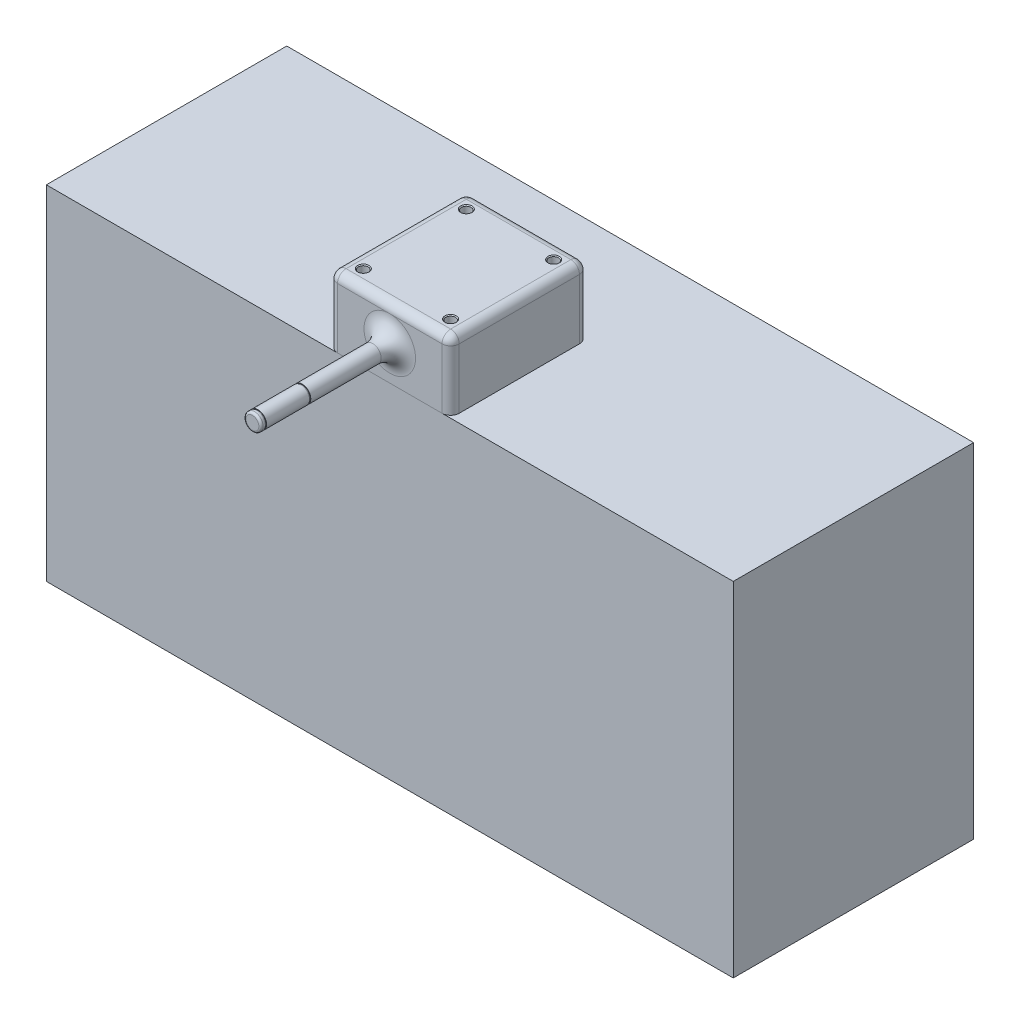
ISO-10303-21;
HEADER;
FILE_DESCRIPTION(('STEP AP214'),'2;1');
FILE_NAME('part.step','',(''),(''),'','','');
FILE_SCHEMA(('AUTOMOTIVE_DESIGN { 1 0 10303 214 1 1 1 1 }'));
ENDSEC;
DATA;
#1=APPLICATION_CONTEXT('core data for automotive mechanical design processes');
#2=APPLICATION_PROTOCOL_DEFINITION('international standard','automotive_design',2000,#1);
#3=PRODUCT_CONTEXT('',#1,'mechanical');
#4=PRODUCT('Part','Part','',(#3));
#5=PRODUCT_RELATED_PRODUCT_CATEGORY('part','',(#4));
#6=PRODUCT_DEFINITION_FORMATION('','',#4);
#7=PRODUCT_DEFINITION_CONTEXT('part definition',#1,'design');
#8=PRODUCT_DEFINITION('design','',#6,#7);
#9=PRODUCT_DEFINITION_SHAPE('','',#8);
#10=(LENGTH_UNIT() NAMED_UNIT(*) SI_UNIT(.MILLI.,.METRE.));
#11=(NAMED_UNIT(*) PLANE_ANGLE_UNIT() SI_UNIT($,.RADIAN.));
#12=(NAMED_UNIT(*) SI_UNIT($,.STERADIAN.) SOLID_ANGLE_UNIT());
#13=UNCERTAINTY_MEASURE_WITH_UNIT(LENGTH_MEASURE(1.E-05),#10,'distance_accuracy_value','');
#14=(GEOMETRIC_REPRESENTATION_CONTEXT(3) GLOBAL_UNCERTAINTY_ASSIGNED_CONTEXT((#13)) GLOBAL_UNIT_ASSIGNED_CONTEXT((#10,
#11,#12)) REPRESENTATION_CONTEXT('',''));
#15=CARTESIAN_POINT('',(0.,0.,0.));
#16=DIRECTION('',(0.,0.,1.));
#17=DIRECTION('',(1.,0.,0.));
#18=AXIS2_PLACEMENT_3D('',#15,#16,#17);
#19=CARTESIAN_POINT('',(254.,-279.4,0.));
#20=DIRECTION('',(-1.,0.,0.));
#21=DIRECTION('',(0.,0.,1.));
#22=AXIS2_PLACEMENT_3D('',#19,#20,#21);
#23=PLANE('',#22);
#24=DIRECTION('',(0.,0.,1.));
#25=VECTOR('',#24,1.);
#26=CARTESIAN_POINT('',(254.,-25.4,0.));
#27=LINE('',#26,#25);
#28=CARTESIAN_POINT('',(254.,-25.4,-177.8));
#29=VERTEX_POINT('',#28);
#30=CARTESIAN_POINT('',(254.,-25.4,0.));
#31=VERTEX_POINT('',#30);
#32=EDGE_CURVE('E112',#29,#31,#27,.T.);
#33=ORIENTED_EDGE('',*,*,#32,.T.);
#34=DIRECTION('',(0.,1.,0.));
#35=VECTOR('',#34,1.);
#36=CARTESIAN_POINT('',(254.,-279.4,0.));
#37=LINE('',#36,#35);
#38=CARTESIAN_POINT('',(254.,-279.4,0.));
#39=VERTEX_POINT('',#38);
#40=EDGE_CURVE('E12',#39,#31,#37,.T.);
#41=ORIENTED_EDGE('',*,*,#40,.F.);
#42=DIRECTION('',(0.,0.,1.));
#43=VECTOR('',#42,1.);
#44=CARTESIAN_POINT('',(254.,-279.4,0.));
#45=LINE('',#44,#43);
#46=CARTESIAN_POINT('',(254.,-279.4,-177.8));
#47=VERTEX_POINT('',#46);
#48=EDGE_CURVE('E105',#47,#39,#45,.T.);
#49=ORIENTED_EDGE('',*,*,#48,.F.);
#50=DIRECTION('',(0.,1.,0.));
#51=VECTOR('',#50,1.);
#52=CARTESIAN_POINT('',(254.,-279.4,-177.8));
#53=LINE('',#52,#51);
#54=EDGE_CURVE('E109',#47,#29,#53,.T.);
#55=ORIENTED_EDGE('',*,*,#54,.T.);
#56=EDGE_LOOP('',(#33,#41,#49,#55));
#57=FACE_BOUND('',#56,.T.);
#58=ADVANCED_FACE('F51',(#57),#23,.F.);
#59=CARTESIAN_POINT('',(-254.,-279.4,0.));
#60=DIRECTION('',(0.,0.,-1.));
#61=DIRECTION('',(-1.,0.,0.));
#62=AXIS2_PLACEMENT_3D('',#59,#60,#61);
#63=PLANE('',#62);
#64=DIRECTION('',(-1.,0.,0.));
#65=VECTOR('',#64,1.);
#66=CARTESIAN_POINT('',(-254.,-25.4,0.));
#67=LINE('',#66,#65);
#68=CARTESIAN_POINT('',(-254.,-25.4,0.));
#69=VERTEX_POINT('',#68);
#70=EDGE_CURVE('E106',#31,#69,#67,.T.);
#71=ORIENTED_EDGE('',*,*,#70,.T.);
#72=DIRECTION('',(0.,1.,0.));
#73=VECTOR('',#72,1.);
#74=CARTESIAN_POINT('',(-254.,-279.4,0.));
#75=LINE('',#74,#73);
#76=CARTESIAN_POINT('',(-254.,-279.4,0.));
#77=VERTEX_POINT('',#76);
#78=EDGE_CURVE('E56',#77,#69,#75,.T.);
#79=ORIENTED_EDGE('',*,*,#78,.F.);
#80=DIRECTION('',(-1.,0.,0.));
#81=VECTOR('',#80,1.);
#82=CARTESIAN_POINT('',(-254.,-279.4,0.));
#83=LINE('',#82,#81);
#84=EDGE_CURVE('E97',#39,#77,#83,.T.);
#85=ORIENTED_EDGE('',*,*,#84,.F.);
#86=ORIENTED_EDGE('',*,*,#40,.T.);
#87=EDGE_LOOP('',(#71,#79,#85,#86));
#88=FACE_BOUND('',#87,.T.);
#89=ADVANCED_FACE('F102',(#88),#63,.F.);
#90=CARTESIAN_POINT('',(-254.,-279.4,0.));
#91=DIRECTION('',(1.,0.,0.));
#92=DIRECTION('',(0.,0.,-1.));
#93=AXIS2_PLACEMENT_3D('',#90,#91,#92);
#94=PLANE('',#93);
#95=DIRECTION('',(0.,0.,-1.));
#96=VECTOR('',#95,1.);
#97=CARTESIAN_POINT('',(-254.,-25.4,0.));
#98=LINE('',#97,#96);
#99=CARTESIAN_POINT('',(-254.,-25.4,-177.8));
#100=VERTEX_POINT('',#99);
#101=EDGE_CURVE('E85',#69,#100,#98,.T.);
#102=ORIENTED_EDGE('',*,*,#101,.T.);
#103=DIRECTION('',(0.,1.,0.));
#104=VECTOR('',#103,1.);
#105=CARTESIAN_POINT('',(-254.,-279.4,-177.8));
#106=LINE('',#105,#104);
#107=CARTESIAN_POINT('',(-254.,-279.4,-177.8));
#108=VERTEX_POINT('',#107);
#109=EDGE_CURVE('E110',#108,#100,#106,.T.);
#110=ORIENTED_EDGE('',*,*,#109,.F.);
#111=DIRECTION('',(0.,0.,-1.));
#112=VECTOR('',#111,1.);
#113=CARTESIAN_POINT('',(-254.,-279.4,0.));
#114=LINE('',#113,#112);
#115=EDGE_CURVE('E99',#77,#108,#114,.T.);
#116=ORIENTED_EDGE('',*,*,#115,.F.);
#117=ORIENTED_EDGE('',*,*,#78,.T.);
#118=EDGE_LOOP('',(#102,#110,#116,#117));
#119=FACE_BOUND('',#118,.T.);
#120=ADVANCED_FACE('F108',(#119),#94,.F.);
#121=CARTESIAN_POINT('',(-254.,-279.4,-177.8));
#122=DIRECTION('',(0.,0.,1.));
#123=DIRECTION('',(1.,0.,0.));
#124=AXIS2_PLACEMENT_3D('',#121,#122,#123);
#125=PLANE('',#124);
#126=DIRECTION('',(1.,0.,0.));
#127=VECTOR('',#126,1.);
#128=CARTESIAN_POINT('',(-254.,-25.4,-177.8));
#129=LINE('',#128,#127);
#130=EDGE_CURVE('E87',#100,#29,#129,.T.);
#131=ORIENTED_EDGE('',*,*,#130,.T.);
#132=ORIENTED_EDGE('',*,*,#54,.F.);
#133=DIRECTION('',(1.,0.,0.));
#134=VECTOR('',#133,1.);
#135=CARTESIAN_POINT('',(-254.,-279.4,-177.8));
#136=LINE('',#135,#134);
#137=EDGE_CURVE('E66',#108,#47,#136,.T.);
#138=ORIENTED_EDGE('',*,*,#137,.F.);
#139=ORIENTED_EDGE('',*,*,#109,.T.);
#140=EDGE_LOOP('',(#131,#132,#138,#139));
#141=FACE_BOUND('',#140,.T.);
#142=ADVANCED_FACE('F122',(#141),#125,.F.);
#143=CARTESIAN_POINT('',(0.,-279.4,0.));
#144=DIRECTION('',(0.,-1.,0.));
#145=DIRECTION('',(0.,0.,-1.));
#146=AXIS2_PLACEMENT_3D('',#143,#144,#145);
#147=PLANE('',#146);
#148=ORIENTED_EDGE('',*,*,#48,.T.);
#149=ORIENTED_EDGE('',*,*,#84,.T.);
#150=ORIENTED_EDGE('',*,*,#115,.T.);
#151=ORIENTED_EDGE('',*,*,#137,.T.);
#152=EDGE_LOOP('',(#148,#149,#150,#151));
#153=FACE_BOUND('',#152,.T.);
#154=ADVANCED_FACE('F96',(#153),#147,.T.);
#155=CARTESIAN_POINT('',(0.,-25.4,0.));
#156=DIRECTION('',(0.,-1.,0.));
#157=DIRECTION('',(0.,0.,-1.));
#158=AXIS2_PLACEMENT_3D('',#155,#156,#157);
#159=PLANE('',#158);
#160=ORIENTED_EDGE('',*,*,#32,.F.);
#161=ORIENTED_EDGE('',*,*,#130,.F.);
#162=ORIENTED_EDGE('',*,*,#101,.F.);
#163=ORIENTED_EDGE('',*,*,#70,.F.);
#164=EDGE_LOOP('',(#160,#161,#162,#163));
#165=FACE_BOUND('',#164,.T.);
#166=ADVANCED_FACE('F121',(#165),#159,.F.);
#167=CLOSED_SHELL('',(#58,#89,#120,#142,#154,#166));
#168=MANIFOLD_SOLID_BREP('B2',#167);
#169=CARTESIAN_POINT('',(0.,0.,101.6));
#170=DIRECTION('',(0.,0.,-1.));
#171=DIRECTION('',(-1.,0.,0.));
#172=AXIS2_PLACEMENT_3D('',#169,#170,#171);
#173=CYLINDRICAL_SURFACE('',#172,6.35);
#174=CARTESIAN_POINT('',(0.,0.,12.7));
#175=DIRECTION('',(0.,0.,-1.));
#176=DIRECTION('',(-1.,0.,0.));
#177=AXIS2_PLACEMENT_3D('',#174,#175,#176);
#178=CIRCLE('',#177,6.35);
#179=CARTESIAN_POINT('',(-6.35,0.,12.7));
#180=VERTEX_POINT('',#179);
#181=EDGE_CURVE('E320',#180,#180,#178,.F.);
#182=ORIENTED_EDGE('',*,*,#181,.T.);
#183=EDGE_LOOP('',(#182));
#184=FACE_BOUND('',#183,.T.);
#185=CARTESIAN_POINT('',(0.,0.,64.77));
#186=DIRECTION('',(0.,0.,1.));
#187=DIRECTION('',(1.,0.,0.));
#188=AXIS2_PLACEMENT_3D('',#185,#186,#187);
#189=CIRCLE('',#188,6.35);
#190=CARTESIAN_POINT('',(6.35,0.,64.77));
#191=VERTEX_POINT('',#190);
#192=EDGE_CURVE('E412',#191,#191,#189,.T.);
#193=ORIENTED_EDGE('',*,*,#192,.F.);
#194=EDGE_LOOP('',(#193));
#195=FACE_BOUND('',#194,.T.);
#196=ADVANCED_FACE('F174',(#184,#195),#173,.T.);
#197=CARTESIAN_POINT('',(-45.,25.4,-101.6));
#198=DIRECTION('',(0.,-1.,0.));
#199=DIRECTION('',(0.,0.,-1.));
#200=AXIS2_PLACEMENT_3D('',#197,#198,#199);
#201=PLANE('',#200);
#202=CARTESIAN_POINT('',(-32.3,25.4,-88.9));
#203=DIRECTION('',(0.,1.,0.));
#204=DIRECTION('',(0.,0.,1.));
#205=AXIS2_PLACEMENT_3D('',#202,#203,#204);
#206=CIRCLE('',#205,4.2037);
#207=CARTESIAN_POINT('',(-32.3,25.4,-84.6963));
#208=VERTEX_POINT('',#207);
#209=EDGE_CURVE('E402',#208,#208,#206,.T.);
#210=ORIENTED_EDGE('',*,*,#209,.F.);
#211=EDGE_LOOP('',(#210));
#212=FACE_BOUND('',#211,.T.);
#213=CARTESIAN_POINT('',(-32.3,25.4,-12.7));
#214=DIRECTION('',(0.,1.,0.));
#215=DIRECTION('',(0.,0.,1.));
#216=AXIS2_PLACEMENT_3D('',#213,#214,#215);
#217=CIRCLE('',#216,4.2037);
#218=CARTESIAN_POINT('',(-32.3,25.4,-8.4963));
#219=VERTEX_POINT('',#218);
#220=EDGE_CURVE('E421',#219,#219,#217,.T.);
#221=ORIENTED_EDGE('',*,*,#220,.F.);
#222=EDGE_LOOP('',(#221));
#223=FACE_BOUND('',#222,.T.);
#224=CARTESIAN_POINT('',(32.3,25.4,-12.7));
#225=DIRECTION('',(0.,1.,0.));
#226=DIRECTION('',(0.,0.,1.));
#227=AXIS2_PLACEMENT_3D('',#224,#225,#226);
#228=CIRCLE('',#227,4.2037);
#229=CARTESIAN_POINT('',(32.3,25.4,-8.49629999999999));
#230=VERTEX_POINT('',#229);
#231=EDGE_CURVE('E435',#230,#230,#228,.T.);
#232=ORIENTED_EDGE('',*,*,#231,.F.);
#233=EDGE_LOOP('',(#232));
#234=FACE_BOUND('',#233,.T.);
#235=CARTESIAN_POINT('',(32.3,25.4,-88.9));
#236=DIRECTION('',(0.,1.,0.));
#237=DIRECTION('',(0.,0.,1.));
#238=AXIS2_PLACEMENT_3D('',#235,#236,#237);
#239=CIRCLE('',#238,4.2037);
#240=CARTESIAN_POINT('',(32.3,25.4,-84.6963));
#241=VERTEX_POINT('',#240);
#242=EDGE_CURVE('E441',#241,#241,#239,.T.);
#243=ORIENTED_EDGE('',*,*,#242,.F.);
#244=EDGE_LOOP('',(#243));
#245=FACE_BOUND('',#244,.T.);
#246=DIRECTION('',(0.,0.,1.));
#247=VECTOR('',#246,1.);
#248=CARTESIAN_POINT('',(38.65,25.4,-101.6));
#249=LINE('',#248,#247);
#250=CARTESIAN_POINT('',(38.65,25.4,-6.34999999999999));
#251=VERTEX_POINT('',#250);
#252=CARTESIAN_POINT('',(38.65,25.4,-95.25));
#253=VERTEX_POINT('',#252);
#254=EDGE_CURVE('E191',#251,#253,#249,.F.);
#255=ORIENTED_EDGE('',*,*,#254,.T.);
#256=DIRECTION('',(1.,0.,0.));
#257=VECTOR('',#256,1.);
#258=CARTESIAN_POINT('',(-45.,25.4,-95.25));
#259=LINE('',#258,#257);
#260=CARTESIAN_POINT('',(-38.65,25.4,-95.25));
#261=VERTEX_POINT('',#260);
#262=EDGE_CURVE('E314',#253,#261,#259,.F.);
#263=ORIENTED_EDGE('',*,*,#262,.T.);
#264=DIRECTION('',(0.,0.,1.));
#265=VECTOR('',#264,1.);
#266=CARTESIAN_POINT('',(-38.65,25.4,0.));
#267=LINE('',#266,#265);
#268=CARTESIAN_POINT('',(-38.65,25.4,-6.34999999999999));
#269=VERTEX_POINT('',#268);
#270=EDGE_CURVE('E309',#261,#269,#267,.T.);
#271=ORIENTED_EDGE('',*,*,#270,.T.);
#272=DIRECTION('',(1.,0.,0.));
#273=VECTOR('',#272,1.);
#274=CARTESIAN_POINT('',(-45.,25.4,-6.34999999999999));
#275=LINE('',#274,#273);
#276=EDGE_CURVE('E315',#269,#251,#275,.T.);
#277=ORIENTED_EDGE('',*,*,#276,.T.);
#278=EDGE_LOOP('',(#255,#263,#271,#277));
#279=FACE_BOUND('',#278,.T.);
#280=ADVANCED_FACE('F372',(#212,#223,#234,#245,#279),#201,.F.);
#281=CARTESIAN_POINT('',(45.,25.4,-101.6));
#282=DIRECTION('',(-1.,0.,0.));
#283=DIRECTION('',(0.,0.,1.));
#284=AXIS2_PLACEMENT_3D('',#281,#282,#283);
#285=PLANE('',#284);
#286=DIRECTION('',(0.,0.,1.));
#287=VECTOR('',#286,1.);
#288=CARTESIAN_POINT('',(45.,19.05,-101.6));
#289=LINE('',#288,#287);
#290=CARTESIAN_POINT('',(45.,19.05,-95.25));
#291=VERTEX_POINT('',#290);
#292=CARTESIAN_POINT('',(45.,19.05,-6.34999999999999));
#293=VERTEX_POINT('',#292);
#294=EDGE_CURVE('E273',#291,#293,#289,.T.);
#295=ORIENTED_EDGE('',*,*,#294,.T.);
#296=DIRECTION('',(0.,-1.,0.));
#297=VECTOR('',#296,1.);
#298=CARTESIAN_POINT('',(45.,25.4,-6.34999999999999));
#299=LINE('',#298,#297);
#300=CARTESIAN_POINT('',(45.,-25.4,-6.34999999999999));
#301=VERTEX_POINT('',#300);
#302=EDGE_CURVE('E274',#293,#301,#299,.T.);
#303=ORIENTED_EDGE('',*,*,#302,.T.);
#304=DIRECTION('',(0.,0.,1.));
#305=VECTOR('',#304,1.);
#306=CARTESIAN_POINT('',(45.,-25.4,-101.6));
#307=LINE('',#306,#305);
#308=CARTESIAN_POINT('',(45.,-25.4,-95.25));
#309=VERTEX_POINT('',#308);
#310=EDGE_CURVE('E260',#309,#301,#307,.T.);
#311=ORIENTED_EDGE('',*,*,#310,.F.);
#312=DIRECTION('',(0.,-1.,0.));
#313=VECTOR('',#312,1.);
#314=CARTESIAN_POINT('',(45.,25.4,-95.25));
#315=LINE('',#314,#313);
#316=EDGE_CURVE('E272',#309,#291,#315,.F.);
#317=ORIENTED_EDGE('',*,*,#316,.T.);
#318=EDGE_LOOP('',(#295,#303,#311,#317));
#319=FACE_BOUND('',#318,.T.);
#320=ADVANCED_FACE('F269',(#319),#285,.F.);
#321=CARTESIAN_POINT('',(-45.,-25.4,-101.6));
#322=DIRECTION('',(0.,-1.,0.));
#323=DIRECTION('',(0.,0.,-1.));
#324=AXIS2_PLACEMENT_3D('',#321,#322,#323);
#325=PLANE('',#324);
#326=CARTESIAN_POINT('',(-32.3,-25.4,-88.9));
#327=DIRECTION('',(0.,1.,0.));
#328=DIRECTION('',(0.,0.,1.));
#329=AXIS2_PLACEMENT_3D('',#326,#327,#328);
#330=CIRCLE('',#329,3.56869999999996);
#331=CARTESIAN_POINT('',(-32.3,-25.4,-85.3313));
#332=VERTEX_POINT('',#331);
#333=EDGE_CURVE('E419',#332,#332,#330,.T.);
#334=ORIENTED_EDGE('',*,*,#333,.T.);
#335=EDGE_LOOP('',(#334));
#336=FACE_BOUND('',#335,.T.);
#337=CARTESIAN_POINT('',(-32.3,-25.4,-12.7));
#338=DIRECTION('',(0.,1.,0.));
#339=DIRECTION('',(0.,0.,1.));
#340=AXIS2_PLACEMENT_3D('',#337,#338,#339);
#341=CIRCLE('',#340,3.56869999999996);
#342=CARTESIAN_POINT('',(-32.3,-25.4,-9.13130000000004));
#343=VERTEX_POINT('',#342);
#344=EDGE_CURVE('E429',#343,#343,#341,.T.);
#345=ORIENTED_EDGE('',*,*,#344,.T.);
#346=EDGE_LOOP('',(#345));
#347=FACE_BOUND('',#346,.T.);
#348=CARTESIAN_POINT('',(32.3,-25.4,-12.7));
#349=DIRECTION('',(0.,1.,0.));
#350=DIRECTION('',(0.,0.,1.));
#351=AXIS2_PLACEMENT_3D('',#348,#349,#350);
#352=CIRCLE('',#351,3.56869999999997);
#353=CARTESIAN_POINT('',(32.3,-25.4,-9.13130000000003));
#354=VERTEX_POINT('',#353);
#355=EDGE_CURVE('E438',#354,#354,#352,.T.);
#356=ORIENTED_EDGE('',*,*,#355,.T.);
#357=EDGE_LOOP('',(#356));
#358=FACE_BOUND('',#357,.T.);
#359=CARTESIAN_POINT('',(32.3,-25.4,-88.9));
#360=DIRECTION('',(0.,1.,0.));
#361=DIRECTION('',(0.,0.,1.));
#362=AXIS2_PLACEMENT_3D('',#359,#360,#361);
#363=CIRCLE('',#362,3.56869999999996);
#364=CARTESIAN_POINT('',(32.3,-25.4,-85.3313000000001));
#365=VERTEX_POINT('',#364);
#366=EDGE_CURVE('E324',#365,#365,#363,.T.);
#367=ORIENTED_EDGE('',*,*,#366,.T.);
#368=EDGE_LOOP('',(#367));
#369=FACE_BOUND('',#368,.T.);
#370=ORIENTED_EDGE('',*,*,#310,.T.);
#371=CARTESIAN_POINT('',(38.65,-25.4,-6.34999999999999));
#372=DIRECTION('',(0.,-1.,0.));
#373=DIRECTION('',(0.,0.,-1.));
#374=AXIS2_PLACEMENT_3D('',#371,#372,#373);
#375=CIRCLE('',#374,6.35);
#376=CARTESIAN_POINT('',(38.65,-25.4,0.));
#377=VERTEX_POINT('',#376);
#378=EDGE_CURVE('E262',#301,#377,#375,.T.);
#379=ORIENTED_EDGE('',*,*,#378,.T.);
#380=DIRECTION('',(1.,0.,0.));
#381=VECTOR('',#380,1.);
#382=CARTESIAN_POINT('',(-45.,-25.4,0.));
#383=LINE('',#382,#381);
#384=CARTESIAN_POINT('',(-38.65,-25.4,0.));
#385=VERTEX_POINT('',#384);
#386=EDGE_CURVE('E352',#385,#377,#383,.T.);
#387=ORIENTED_EDGE('',*,*,#386,.F.);
#388=CARTESIAN_POINT('',(-38.65,-25.4,-6.35));
#389=DIRECTION('',(0.,-1.,0.));
#390=DIRECTION('',(0.,0.,-1.));
#391=AXIS2_PLACEMENT_3D('',#388,#389,#390);
#392=CIRCLE('',#391,6.35);
#393=CARTESIAN_POINT('',(-45.,-25.4,-6.34999999999999));
#394=VERTEX_POINT('',#393);
#395=EDGE_CURVE('E285',#385,#394,#392,.T.);
#396=ORIENTED_EDGE('',*,*,#395,.T.);
#397=DIRECTION('',(0.,0.,1.));
#398=VECTOR('',#397,1.);
#399=CARTESIAN_POINT('',(-45.,-25.4,-101.6));
#400=LINE('',#399,#398);
#401=CARTESIAN_POINT('',(-45.,-25.4,-95.25));
#402=VERTEX_POINT('',#401);
#403=EDGE_CURVE('E278',#402,#394,#400,.T.);
#404=ORIENTED_EDGE('',*,*,#403,.F.);
#405=CARTESIAN_POINT('',(-38.65,-25.4,-95.25));
#406=DIRECTION('',(0.,-1.,0.));
#407=DIRECTION('',(0.,0.,-1.));
#408=AXIS2_PLACEMENT_3D('',#405,#406,#407);
#409=CIRCLE('',#408,6.35);
#410=CARTESIAN_POINT('',(-38.65,-25.4,-101.6));
#411=VERTEX_POINT('',#410);
#412=EDGE_CURVE('E266',#402,#411,#409,.T.);
#413=ORIENTED_EDGE('',*,*,#412,.T.);
#414=DIRECTION('',(1.,0.,0.));
#415=VECTOR('',#414,1.);
#416=CARTESIAN_POINT('',(-45.,-25.4,-101.6));
#417=LINE('',#416,#415);
#418=CARTESIAN_POINT('',(38.65,-25.4,-101.6));
#419=VERTEX_POINT('',#418);
#420=EDGE_CURVE('E264',#411,#419,#417,.T.);
#421=ORIENTED_EDGE('',*,*,#420,.T.);
#422=CARTESIAN_POINT('',(38.65,-25.4,-95.25));
#423=DIRECTION('',(0.,-1.,0.));
#424=DIRECTION('',(0.,0.,-1.));
#425=AXIS2_PLACEMENT_3D('',#422,#423,#424);
#426=CIRCLE('',#425,6.35);
#427=EDGE_CURVE('E258',#419,#309,#426,.T.);
#428=ORIENTED_EDGE('',*,*,#427,.T.);
#429=EDGE_LOOP('',(#370,#379,#387,#396,#404,#413,#421,#428));
#430=FACE_BOUND('',#429,.T.);
#431=ADVANCED_FACE('F257',(#336,#347,#358,#369,#430),#325,.T.);
#432=CARTESIAN_POINT('',(-45.,25.4,-101.6));
#433=DIRECTION('',(-1.,0.,0.));
#434=DIRECTION('',(0.,0.,1.));
#435=AXIS2_PLACEMENT_3D('',#432,#433,#434);
#436=PLANE('',#435);
#437=DIRECTION('',(0.,0.,1.));
#438=VECTOR('',#437,1.);
#439=CARTESIAN_POINT('',(-45.,19.05,-101.6));
#440=LINE('',#439,#438);
#441=CARTESIAN_POINT('',(-45.,19.05,-6.35));
#442=VERTEX_POINT('',#441);
#443=CARTESIAN_POINT('',(-45.,19.05,-95.25));
#444=VERTEX_POINT('',#443);
#445=EDGE_CURVE('E302',#442,#444,#440,.F.);
#446=ORIENTED_EDGE('',*,*,#445,.T.);
#447=DIRECTION('',(0.,-1.,0.));
#448=VECTOR('',#447,1.);
#449=CARTESIAN_POINT('',(-45.,25.4,-95.25));
#450=LINE('',#449,#448);
#451=EDGE_CURVE('E308',#444,#402,#450,.T.);
#452=ORIENTED_EDGE('',*,*,#451,.T.);
#453=ORIENTED_EDGE('',*,*,#403,.T.);
#454=DIRECTION('',(0.,-1.,0.));
#455=VECTOR('',#454,1.);
#456=CARTESIAN_POINT('',(-45.,25.4,-6.35));
#457=LINE('',#456,#455);
#458=EDGE_CURVE('E306',#394,#442,#457,.F.);
#459=ORIENTED_EDGE('',*,*,#458,.T.);
#460=EDGE_LOOP('',(#446,#452,#453,#459));
#461=FACE_BOUND('',#460,.T.);
#462=ADVANCED_FACE('F459',(#461),#436,.T.);
#463=CARTESIAN_POINT('',(0.,0.,-101.6));
#464=DIRECTION('',(0.,0.,-1.));
#465=DIRECTION('',(-1.,0.,0.));
#466=AXIS2_PLACEMENT_3D('',#463,#464,#465);
#467=PLANE('',#466);
#468=DIRECTION('',(1.,0.,0.));
#469=VECTOR('',#468,1.);
#470=CARTESIAN_POINT('',(45.,19.05,-101.6));
#471=LINE('',#470,#469);
#472=CARTESIAN_POINT('',(-38.65,19.05,-101.6));
#473=VERTEX_POINT('',#472);
#474=CARTESIAN_POINT('',(38.65,19.05,-101.6));
#475=VERTEX_POINT('',#474);
#476=EDGE_CURVE('E296',#473,#475,#471,.T.);
#477=ORIENTED_EDGE('',*,*,#476,.T.);
#478=DIRECTION('',(0.,-1.,0.));
#479=VECTOR('',#478,1.);
#480=CARTESIAN_POINT('',(38.65,-25.4,-101.6));
#481=LINE('',#480,#479);
#482=EDGE_CURVE('E305',#475,#419,#481,.T.);
#483=ORIENTED_EDGE('',*,*,#482,.T.);
#484=ORIENTED_EDGE('',*,*,#420,.F.);
#485=DIRECTION('',(0.,-1.,0.));
#486=VECTOR('',#485,1.);
#487=CARTESIAN_POINT('',(-38.65,0.,-101.6));
#488=LINE('',#487,#486);
#489=EDGE_CURVE('E297',#411,#473,#488,.F.);
#490=ORIENTED_EDGE('',*,*,#489,.T.);
#491=EDGE_LOOP('',(#477,#483,#484,#490));
#492=FACE_BOUND('',#491,.T.);
#493=ADVANCED_FACE('F484',(#492),#467,.T.);
#494=CARTESIAN_POINT('',(0.,0.,0.));
#495=DIRECTION('',(0.,0.,-1.));
#496=DIRECTION('',(-1.,0.,0.));
#497=AXIS2_PLACEMENT_3D('',#494,#495,#496);
#498=PLANE('',#497);
#499=DIRECTION('',(1.,0.,0.));
#500=VECTOR('',#499,1.);
#501=CARTESIAN_POINT('',(0.,19.05,0.));
#502=LINE('',#501,#500);
#503=CARTESIAN_POINT('',(38.65,19.05,0.));
#504=VERTEX_POINT('',#503);
#505=CARTESIAN_POINT('',(0.,19.05,0.));
#506=VERTEX_POINT('',#505);
#507=EDGE_CURVE('E293',#504,#506,#502,.F.);
#508=ORIENTED_EDGE('',*,*,#507,.T.);
#509=CARTESIAN_POINT('',(0.,0.,0.));
#510=DIRECTION('',(0.,0.,-1.));
#511=DIRECTION('',(-1.,0.,0.));
#512=AXIS2_PLACEMENT_3D('',#509,#510,#511);
#513=CIRCLE('',#512,19.05);
#514=EDGE_CURVE('E189',#506,#506,#513,.T.);
#515=ORIENTED_EDGE('',*,*,#514,.T.);
#516=CARTESIAN_POINT('',(-38.65,19.05,0.));
#517=VERTEX_POINT('',#516);
#518=EDGE_CURVE('E289',#506,#517,#502,.F.);
#519=ORIENTED_EDGE('',*,*,#518,.T.);
#520=DIRECTION('',(0.,-1.,0.));
#521=VECTOR('',#520,1.);
#522=CARTESIAN_POINT('',(-38.65,-25.4,0.));
#523=LINE('',#522,#521);
#524=EDGE_CURVE('E295',#517,#385,#523,.T.);
#525=ORIENTED_EDGE('',*,*,#524,.T.);
#526=ORIENTED_EDGE('',*,*,#386,.T.);
#527=DIRECTION('',(0.,-1.,0.));
#528=VECTOR('',#527,1.);
#529=CARTESIAN_POINT('',(38.65,0.,0.));
#530=LINE('',#529,#528);
#531=EDGE_CURVE('E298',#377,#504,#530,.F.);
#532=ORIENTED_EDGE('',*,*,#531,.T.);
#533=EDGE_LOOP('',(#508,#515,#519,#525,#526,#532));
#534=FACE_BOUND('',#533,.T.);
#535=ADVANCED_FACE('F487',(#534),#498,.F.);
#536=CARTESIAN_POINT('',(-38.65,25.4,-95.25));
#537=DIRECTION('',(0.,-1.,0.));
#538=DIRECTION('',(0.,0.,-1.));
#539=AXIS2_PLACEMENT_3D('',#536,#537,#538);
#540=CYLINDRICAL_SURFACE('',#539,6.35);
#541=CARTESIAN_POINT('',(-38.65,19.05,-95.25));
#542=DIRECTION('',(0.,1.,0.));
#543=DIRECTION('',(0.,0.,1.));
#544=AXIS2_PLACEMENT_3D('',#541,#542,#543);
#545=CIRCLE('',#544,6.35);
#546=EDGE_CURVE('E347',#473,#444,#545,.T.);
#547=ORIENTED_EDGE('',*,*,#546,.F.);
#548=ORIENTED_EDGE('',*,*,#489,.F.);
#549=ORIENTED_EDGE('',*,*,#412,.F.);
#550=ORIENTED_EDGE('',*,*,#451,.F.);
#551=EDGE_LOOP('',(#547,#548,#549,#550));
#552=FACE_BOUND('',#551,.T.);
#553=ADVANCED_FACE('F471',(#552),#540,.T.);
#554=CARTESIAN_POINT('',(-38.65,19.05,-95.25));
#555=DIRECTION('',(-1.,0.,0.));
#556=DIRECTION('',(0.,0.,1.));
#557=AXIS2_PLACEMENT_3D('',#554,#555,#556);
#558=SPHERICAL_SURFACE('',#557,6.35);
#559=CARTESIAN_POINT('',(-38.65,19.05,-95.25));
#560=DIRECTION('',(-1.,0.,0.));
#561=DIRECTION('',(0.,0.,1.));
#562=AXIS2_PLACEMENT_3D('',#559,#560,#561);
#563=CIRCLE('',#562,6.35);
#564=EDGE_CURVE('E345',#473,#261,#563,.F.);
#565=ORIENTED_EDGE('',*,*,#564,.F.);
#566=ORIENTED_EDGE('',*,*,#546,.T.);
#567=CARTESIAN_POINT('',(-38.65,19.05,-95.25));
#568=DIRECTION('',(0.,0.,-1.));
#569=DIRECTION('',(-1.,0.,0.));
#570=AXIS2_PLACEMENT_3D('',#567,#568,#569);
#571=CIRCLE('',#570,6.35);
#572=EDGE_CURVE('E346',#261,#444,#571,.F.);
#573=ORIENTED_EDGE('',*,*,#572,.F.);
#574=EDGE_LOOP('',(#565,#566,#573));
#575=FACE_BOUND('',#574,.T.);
#576=ADVANCED_FACE('F478',(#575),#558,.T.);
#577=CARTESIAN_POINT('',(-38.65,0.,-6.35));
#578=DIRECTION('',(0.,1.,0.));
#579=DIRECTION('',(0.,0.,1.));
#580=AXIS2_PLACEMENT_3D('',#577,#578,#579);
#581=CYLINDRICAL_SURFACE('',#580,6.35);
#582=ORIENTED_EDGE('',*,*,#395,.F.);
#583=ORIENTED_EDGE('',*,*,#524,.F.);
#584=CARTESIAN_POINT('',(-38.65,19.05,-6.35));
#585=DIRECTION('',(0.,1.,0.));
#586=DIRECTION('',(0.,0.,1.));
#587=AXIS2_PLACEMENT_3D('',#584,#585,#586);
#588=CIRCLE('',#587,6.35);
#589=EDGE_CURVE('E343',#442,#517,#588,.T.);
#590=ORIENTED_EDGE('',*,*,#589,.F.);
#591=ORIENTED_EDGE('',*,*,#458,.F.);
#592=EDGE_LOOP('',(#582,#583,#590,#591));
#593=FACE_BOUND('',#592,.T.);
#594=ADVANCED_FACE('F462',(#593),#581,.T.);
#595=CARTESIAN_POINT('',(-38.65,19.05,-101.6));
#596=DIRECTION('',(0.,0.,-1.));
#597=DIRECTION('',(-1.,0.,0.));
#598=AXIS2_PLACEMENT_3D('',#595,#596,#597);
#599=CYLINDRICAL_SURFACE('',#598,6.35);
#600=ORIENTED_EDGE('',*,*,#572,.T.);
#601=ORIENTED_EDGE('',*,*,#445,.F.);
#602=CARTESIAN_POINT('',(-38.65,19.05,-6.34999999999999));
#603=DIRECTION('',(0.,0.,1.));
#604=DIRECTION('',(1.,0.,0.));
#605=AXIS2_PLACEMENT_3D('',#602,#603,#604);
#606=CIRCLE('',#605,6.35);
#607=EDGE_CURVE('E336',#269,#442,#606,.T.);
#608=ORIENTED_EDGE('',*,*,#607,.F.);
#609=ORIENTED_EDGE('',*,*,#270,.F.);
#610=EDGE_LOOP('',(#600,#601,#608,#609));
#611=FACE_BOUND('',#610,.T.);
#612=ADVANCED_FACE('F473',(#611),#599,.T.);
#613=CARTESIAN_POINT('',(0.,19.05,-95.25));
#614=DIRECTION('',(-1.,0.,0.));
#615=DIRECTION('',(0.,0.,1.));
#616=AXIS2_PLACEMENT_3D('',#613,#614,#615);
#617=CYLINDRICAL_SURFACE('',#616,6.35);
#618=ORIENTED_EDGE('',*,*,#564,.T.);
#619=ORIENTED_EDGE('',*,*,#262,.F.);
#620=CARTESIAN_POINT('',(38.65,19.05,-95.25));
#621=DIRECTION('',(1.,0.,0.));
#622=DIRECTION('',(0.,0.,-1.));
#623=AXIS2_PLACEMENT_3D('',#620,#621,#622);
#624=CIRCLE('',#623,6.35);
#625=EDGE_CURVE('E334',#475,#253,#624,.T.);
#626=ORIENTED_EDGE('',*,*,#625,.F.);
#627=ORIENTED_EDGE('',*,*,#476,.F.);
#628=EDGE_LOOP('',(#618,#619,#626,#627));
#629=FACE_BOUND('',#628,.T.);
#630=ADVANCED_FACE('F482',(#629),#617,.T.);
#631=CARTESIAN_POINT('',(38.65,0.,-95.25));
#632=DIRECTION('',(0.,1.,0.));
#633=DIRECTION('',(0.,0.,1.));
#634=AXIS2_PLACEMENT_3D('',#631,#632,#633);
#635=CYLINDRICAL_SURFACE('',#634,6.35);
#636=ORIENTED_EDGE('',*,*,#427,.F.);
#637=ORIENTED_EDGE('',*,*,#482,.F.);
#638=CARTESIAN_POINT('',(38.65,19.05,-95.25));
#639=DIRECTION('',(0.,1.,0.));
#640=DIRECTION('',(0.,0.,1.));
#641=AXIS2_PLACEMENT_3D('',#638,#639,#640);
#642=CIRCLE('',#641,6.35);
#643=EDGE_CURVE('E276',#291,#475,#642,.T.);
#644=ORIENTED_EDGE('',*,*,#643,.F.);
#645=ORIENTED_EDGE('',*,*,#316,.F.);
#646=EDGE_LOOP('',(#636,#637,#644,#645));
#647=FACE_BOUND('',#646,.T.);
#648=ADVANCED_FACE('F277',(#647),#635,.T.);
#649=CARTESIAN_POINT('',(-38.65,19.05,-6.35));
#650=DIRECTION('',(-1.,0.,0.));
#651=DIRECTION('',(0.,0.,1.));
#652=AXIS2_PLACEMENT_3D('',#649,#650,#651);
#653=SPHERICAL_SURFACE('',#652,6.35);
#654=ORIENTED_EDGE('',*,*,#607,.T.);
#655=ORIENTED_EDGE('',*,*,#589,.T.);
#656=CARTESIAN_POINT('',(-38.65,19.05,-6.35));
#657=DIRECTION('',(-1.,0.,0.));
#658=DIRECTION('',(0.,0.,1.));
#659=AXIS2_PLACEMENT_3D('',#656,#657,#658);
#660=CIRCLE('',#659,6.35);
#661=EDGE_CURVE('E331',#269,#517,#660,.F.);
#662=ORIENTED_EDGE('',*,*,#661,.F.);
#663=EDGE_LOOP('',(#654,#655,#662));
#664=FACE_BOUND('',#663,.T.);
#665=ADVANCED_FACE('F466',(#664),#653,.T.);
#666=CARTESIAN_POINT('',(38.65,19.05,-95.25));
#667=DIRECTION('',(0.,0.,-1.));
#668=DIRECTION('',(-1.,0.,0.));
#669=AXIS2_PLACEMENT_3D('',#666,#667,#668);
#670=SPHERICAL_SURFACE('',#669,6.35);
#671=ORIENTED_EDGE('',*,*,#643,.T.);
#672=ORIENTED_EDGE('',*,*,#625,.T.);
#673=CARTESIAN_POINT('',(38.65,19.05,-95.25));
#674=DIRECTION('',(0.,0.,-1.));
#675=DIRECTION('',(-1.,0.,0.));
#676=AXIS2_PLACEMENT_3D('',#673,#674,#675);
#677=CIRCLE('',#676,6.35);
#678=EDGE_CURVE('E330',#291,#253,#677,.F.);
#679=ORIENTED_EDGE('',*,*,#678,.F.);
#680=EDGE_LOOP('',(#671,#672,#679));
#681=FACE_BOUND('',#680,.T.);
#682=ADVANCED_FACE('F517',(#681),#670,.T.);
#683=CARTESIAN_POINT('',(-45.,19.05,-6.34999999999999));
#684=DIRECTION('',(1.,0.,0.));
#685=DIRECTION('',(0.,0.,-1.));
#686=AXIS2_PLACEMENT_3D('',#683,#684,#685);
#687=CYLINDRICAL_SURFACE('',#686,6.35);
#688=ORIENTED_EDGE('',*,*,#661,.T.);
#689=ORIENTED_EDGE('',*,*,#518,.F.);
#690=ORIENTED_EDGE('',*,*,#507,.F.);
#691=CARTESIAN_POINT('',(38.65,19.05,-6.34999999999999));
#692=DIRECTION('',(1.,0.,0.));
#693=DIRECTION('',(0.,0.,-1.));
#694=AXIS2_PLACEMENT_3D('',#691,#692,#693);
#695=CIRCLE('',#694,6.35);
#696=EDGE_CURVE('E321',#251,#504,#695,.T.);
#697=ORIENTED_EDGE('',*,*,#696,.F.);
#698=ORIENTED_EDGE('',*,*,#276,.F.);
#699=EDGE_LOOP('',(#688,#689,#690,#697,#698));
#700=FACE_BOUND('',#699,.T.);
#701=ADVANCED_FACE('F511',(#700),#687,.T.);
#702=CARTESIAN_POINT('',(38.65,19.05,-101.6));
#703=DIRECTION('',(0.,0.,1.));
#704=DIRECTION('',(1.,0.,0.));
#705=AXIS2_PLACEMENT_3D('',#702,#703,#704);
#706=CYLINDRICAL_SURFACE('',#705,6.35);
#707=ORIENTED_EDGE('',*,*,#678,.T.);
#708=ORIENTED_EDGE('',*,*,#254,.F.);
#709=CARTESIAN_POINT('',(38.65,19.05,-6.34999999999999));
#710=DIRECTION('',(0.,0.,1.));
#711=DIRECTION('',(1.,0.,0.));
#712=AXIS2_PLACEMENT_3D('',#709,#710,#711);
#713=CIRCLE('',#712,6.35);
#714=EDGE_CURVE('E323',#293,#251,#713,.T.);
#715=ORIENTED_EDGE('',*,*,#714,.F.);
#716=ORIENTED_EDGE('',*,*,#294,.F.);
#717=EDGE_LOOP('',(#707,#708,#715,#716));
#718=FACE_BOUND('',#717,.T.);
#719=ADVANCED_FACE('F509',(#718),#706,.T.);
#720=CARTESIAN_POINT('',(38.65,19.05,-6.35));
#721=DIRECTION('',(0.,1.,0.));
#722=DIRECTION('',(0.,0.,1.));
#723=AXIS2_PLACEMENT_3D('',#720,#721,#722);
#724=SPHERICAL_SURFACE('',#723,6.35);
#725=ORIENTED_EDGE('',*,*,#714,.T.);
#726=ORIENTED_EDGE('',*,*,#696,.T.);
#727=CARTESIAN_POINT('',(38.65,19.05,-6.35));
#728=DIRECTION('',(0.,1.,0.));
#729=DIRECTION('',(0.,0.,1.));
#730=AXIS2_PLACEMENT_3D('',#727,#728,#729);
#731=CIRCLE('',#730,6.35);
#732=EDGE_CURVE('E319',#293,#504,#731,.F.);
#733=ORIENTED_EDGE('',*,*,#732,.F.);
#734=EDGE_LOOP('',(#725,#726,#733));
#735=FACE_BOUND('',#734,.T.);
#736=ADVANCED_FACE('F506',(#735),#724,.T.);
#737=CARTESIAN_POINT('',(38.65,25.4,-6.34999999999999));
#738=DIRECTION('',(0.,-1.,0.));
#739=DIRECTION('',(0.,0.,-1.));
#740=AXIS2_PLACEMENT_3D('',#737,#738,#739);
#741=CYLINDRICAL_SURFACE('',#740,6.35);
#742=ORIENTED_EDGE('',*,*,#732,.T.);
#743=ORIENTED_EDGE('',*,*,#531,.F.);
#744=ORIENTED_EDGE('',*,*,#378,.F.);
#745=ORIENTED_EDGE('',*,*,#302,.F.);
#746=EDGE_LOOP('',(#742,#743,#744,#745));
#747=FACE_BOUND('',#746,.T.);
#748=ADVANCED_FACE('F505',(#747),#741,.T.);
#749=CARTESIAN_POINT('',(0.,0.,12.7));
#750=DIRECTION('',(0.,0.,-1.));
#751=DIRECTION('',(-1.,0.,0.));
#752=AXIS2_PLACEMENT_3D('',#749,#750,#751);
#753=TOROIDAL_SURFACE('',#752,19.05,12.7);
#754=ORIENTED_EDGE('',*,*,#514,.F.);
#755=EDGE_LOOP('',(#754));
#756=FACE_BOUND('',#755,.T.);
#757=ORIENTED_EDGE('',*,*,#181,.F.);
#758=EDGE_LOOP('',(#757));
#759=FACE_BOUND('',#758,.T.);
#760=ADVANCED_FACE('F504',(#756,#759),#753,.F.);
#761=CARTESIAN_POINT('',(32.3,25.4,-88.9));
#762=DIRECTION('',(0.,1.,0.));
#763=DIRECTION('',(0.,0.,1.));
#764=AXIS2_PLACEMENT_3D('',#761,#762,#763);
#765=CYLINDRICAL_SURFACE('',#764,3.56869999999998);
#766=ORIENTED_EDGE('',*,*,#366,.F.);
#767=EDGE_LOOP('',(#766));
#768=FACE_BOUND('',#767,.T.);
#769=CARTESIAN_POINT('',(32.3,24.765,-88.9));
#770=DIRECTION('',(0.,1.,0.));
#771=DIRECTION('',(0.,0.,1.));
#772=AXIS2_PLACEMENT_3D('',#769,#770,#771);
#773=CIRCLE('',#772,3.5687);
#774=CARTESIAN_POINT('',(32.3,24.765,-85.3313));
#775=VERTEX_POINT('',#774);
#776=EDGE_CURVE('E443',#775,#775,#773,.T.);
#777=ORIENTED_EDGE('',*,*,#776,.T.);
#778=EDGE_LOOP('',(#777));
#779=FACE_BOUND('',#778,.T.);
#780=ADVANCED_FACE('F538',(#768,#779),#765,.F.);
#781=CARTESIAN_POINT('',(32.3,25.4,-88.9));
#782=DIRECTION('',(0.,1.,0.));
#783=DIRECTION('',(0.,0.,1.));
#784=AXIS2_PLACEMENT_3D('',#781,#782,#783);
#785=CONICAL_SURFACE('',#784,4.2037,0.785398163397446);
#786=ORIENTED_EDGE('',*,*,#776,.F.);
#787=EDGE_LOOP('',(#786));
#788=FACE_BOUND('',#787,.T.);
#789=ORIENTED_EDGE('',*,*,#242,.T.);
#790=EDGE_LOOP('',(#789));
#791=FACE_BOUND('',#790,.T.);
#792=ADVANCED_FACE('F536',(#788,#791),#785,.F.);
#793=CARTESIAN_POINT('',(32.3,25.4,-12.7));
#794=DIRECTION('',(0.,1.,0.));
#795=DIRECTION('',(0.,0.,1.));
#796=AXIS2_PLACEMENT_3D('',#793,#794,#795);
#797=CYLINDRICAL_SURFACE('',#796,3.56869999999998);
#798=ORIENTED_EDGE('',*,*,#355,.F.);
#799=EDGE_LOOP('',(#798));
#800=FACE_BOUND('',#799,.T.);
#801=CARTESIAN_POINT('',(32.3,24.765,-12.7));
#802=DIRECTION('',(0.,1.,0.));
#803=DIRECTION('',(0.,0.,1.));
#804=AXIS2_PLACEMENT_3D('',#801,#802,#803);
#805=CIRCLE('',#804,3.5687);
#806=CARTESIAN_POINT('',(32.3,24.765,-9.1313));
#807=VERTEX_POINT('',#806);
#808=EDGE_CURVE('E434',#807,#807,#805,.T.);
#809=ORIENTED_EDGE('',*,*,#808,.T.);
#810=EDGE_LOOP('',(#809));
#811=FACE_BOUND('',#810,.T.);
#812=ADVANCED_FACE('F547',(#800,#811),#797,.F.);
#813=CARTESIAN_POINT('',(32.3,25.4,-12.7));
#814=DIRECTION('',(0.,1.,0.));
#815=DIRECTION('',(0.,0.,1.));
#816=AXIS2_PLACEMENT_3D('',#813,#814,#815);
#817=CONICAL_SURFACE('',#816,4.2037,0.785398163397451);
#818=ORIENTED_EDGE('',*,*,#808,.F.);
#819=EDGE_LOOP('',(#818));
#820=FACE_BOUND('',#819,.T.);
#821=ORIENTED_EDGE('',*,*,#231,.T.);
#822=EDGE_LOOP('',(#821));
#823=FACE_BOUND('',#822,.T.);
#824=ADVANCED_FACE('F558',(#820,#823),#817,.F.);
#825=CARTESIAN_POINT('',(-32.3,25.4,-12.7));
#826=DIRECTION('',(0.,1.,0.));
#827=DIRECTION('',(0.,0.,1.));
#828=AXIS2_PLACEMENT_3D('',#825,#826,#827);
#829=CYLINDRICAL_SURFACE('',#828,3.56869999999998);
#830=ORIENTED_EDGE('',*,*,#344,.F.);
#831=EDGE_LOOP('',(#830));
#832=FACE_BOUND('',#831,.T.);
#833=CARTESIAN_POINT('',(-32.3,24.765,-12.7));
#834=DIRECTION('',(0.,1.,0.));
#835=DIRECTION('',(0.,0.,1.));
#836=AXIS2_PLACEMENT_3D('',#833,#834,#835);
#837=CIRCLE('',#836,3.5687);
#838=CARTESIAN_POINT('',(-32.3,24.765,-9.1313));
#839=VERTEX_POINT('',#838);
#840=EDGE_CURVE('E428',#839,#839,#837,.T.);
#841=ORIENTED_EDGE('',*,*,#840,.T.);
#842=EDGE_LOOP('',(#841));
#843=FACE_BOUND('',#842,.T.);
#844=ADVANCED_FACE('F557',(#832,#843),#829,.F.);
#845=CARTESIAN_POINT('',(-32.3,25.4,-12.7));
#846=DIRECTION('',(0.,1.,0.));
#847=DIRECTION('',(0.,0.,1.));
#848=AXIS2_PLACEMENT_3D('',#845,#846,#847);
#849=CONICAL_SURFACE('',#848,4.2037,0.785398163397448);
#850=ORIENTED_EDGE('',*,*,#840,.F.);
#851=EDGE_LOOP('',(#850));
#852=FACE_BOUND('',#851,.T.);
#853=ORIENTED_EDGE('',*,*,#220,.T.);
#854=EDGE_LOOP('',(#853));
#855=FACE_BOUND('',#854,.T.);
#856=ADVANCED_FACE('F562',(#852,#855),#849,.F.);
#857=CARTESIAN_POINT('',(-32.3,25.4,-88.9));
#858=DIRECTION('',(0.,1.,0.));
#859=DIRECTION('',(0.,0.,1.));
#860=AXIS2_PLACEMENT_3D('',#857,#858,#859);
#861=CYLINDRICAL_SURFACE('',#860,3.56869999999998);
#862=ORIENTED_EDGE('',*,*,#333,.F.);
#863=EDGE_LOOP('',(#862));
#864=FACE_BOUND('',#863,.T.);
#865=CARTESIAN_POINT('',(-32.3,24.765,-88.9));
#866=DIRECTION('',(0.,1.,0.));
#867=DIRECTION('',(0.,0.,1.));
#868=AXIS2_PLACEMENT_3D('',#865,#866,#867);
#869=CIRCLE('',#868,3.5687);
#870=CARTESIAN_POINT('',(-32.3,24.765,-85.3313));
#871=VERTEX_POINT('',#870);
#872=EDGE_CURVE('E403',#871,#871,#869,.T.);
#873=ORIENTED_EDGE('',*,*,#872,.T.);
#874=EDGE_LOOP('',(#873));
#875=FACE_BOUND('',#874,.T.);
#876=ADVANCED_FACE('F568',(#864,#875),#861,.F.);
#877=CARTESIAN_POINT('',(-32.3,25.4,-88.9));
#878=DIRECTION('',(0.,1.,0.));
#879=DIRECTION('',(0.,0.,1.));
#880=AXIS2_PLACEMENT_3D('',#877,#878,#879);
#881=CONICAL_SURFACE('',#880,4.2037,0.785398163397448);
#882=ORIENTED_EDGE('',*,*,#872,.F.);
#883=EDGE_LOOP('',(#882));
#884=FACE_BOUND('',#883,.T.);
#885=ORIENTED_EDGE('',*,*,#209,.T.);
#886=EDGE_LOOP('',(#885));
#887=FACE_BOUND('',#886,.T.);
#888=ADVANCED_FACE('F575',(#884,#887),#881,.F.);
#889=CARTESIAN_POINT('',(0.,0.,64.77));
#890=DIRECTION('',(0.,0.,1.));
#891=DIRECTION('',(1.,0.,0.));
#892=AXIS2_PLACEMENT_3D('',#889,#890,#891);
#893=CYLINDRICAL_SURFACE('',#892,5.842);
#894=CARTESIAN_POINT('',(0.,0.,64.77));
#895=DIRECTION('',(0.,0.,1.));
#896=DIRECTION('',(1.,0.,0.));
#897=AXIS2_PLACEMENT_3D('',#894,#895,#896);
#898=CIRCLE('',#897,5.842);
#899=CARTESIAN_POINT('',(5.842,0.,64.77));
#900=VERTEX_POINT('',#899);
#901=EDGE_CURVE('E597',#900,#900,#898,.T.);
#902=CARTESIAN_POINT('',(0.,0.,65.7225));
#903=DIRECTION('',(0.,0.,1.));
#904=DIRECTION('',(1.,0.,0.));
#905=AXIS2_PLACEMENT_3D('',#902,#903,#904);
#906=CIRCLE('',#905,5.842);
#907=CARTESIAN_POINT('',(5.842,0.,65.7225));
#908=VERTEX_POINT('',#907);
#909=EDGE_CURVE('E602',#908,#908,#906,.T.);
#910=CARTESIAN_POINT('',(5.842,0.,64.77));
#911=CARTESIAN_POINT('',(5.842,0.,64.779921875));
#912=CARTESIAN_POINT('',(5.842,0.,64.78984375));
#913=CARTESIAN_POINT('',(5.842,0.,64.8096875));
#914=CARTESIAN_POINT('',(5.842,0.,64.819609375));
#915=CARTESIAN_POINT('',(5.842,0.,64.839453125));
#916=CARTESIAN_POINT('',(5.842,0.,64.849375));
#917=CARTESIAN_POINT('',(5.842,0.,64.86921875));
#918=CARTESIAN_POINT('',(5.842,0.,64.879140625));
#919=CARTESIAN_POINT('',(5.842,0.,64.898984375));
#920=CARTESIAN_POINT('',(5.842,0.,64.90890625));
#921=CARTESIAN_POINT('',(5.842,0.,64.92875));
#922=CARTESIAN_POINT('',(5.842,0.,64.938671875));
#923=CARTESIAN_POINT('',(5.842,0.,64.958515625));
#924=CARTESIAN_POINT('',(5.842,0.,64.9684375));
#925=CARTESIAN_POINT('',(5.842,0.,64.98828125));
#926=CARTESIAN_POINT('',(5.842,0.,64.998203125));
#927=CARTESIAN_POINT('',(5.842,0.,65.018046875));
#928=CARTESIAN_POINT('',(5.842,0.,65.02796875));
#929=CARTESIAN_POINT('',(5.842,0.,65.0478125));
#930=CARTESIAN_POINT('',(5.842,0.,65.057734375));
#931=CARTESIAN_POINT('',(5.842,0.,65.077578125));
#932=CARTESIAN_POINT('',(5.842,0.,65.0875));
#933=CARTESIAN_POINT('',(5.842,0.,65.10734375));
#934=CARTESIAN_POINT('',(5.842,0.,65.117265625));
#935=CARTESIAN_POINT('',(5.842,0.,65.137109375));
#936=CARTESIAN_POINT('',(5.842,0.,65.14703125));
#937=CARTESIAN_POINT('',(5.842,0.,65.166875));
#938=CARTESIAN_POINT('',(5.842,0.,65.176796875));
#939=CARTESIAN_POINT('',(5.842,0.,65.196640625));
#940=CARTESIAN_POINT('',(5.842,0.,65.2065625));
#941=CARTESIAN_POINT('',(5.842,0.,65.22640625));
#942=CARTESIAN_POINT('',(5.842,0.,65.236328125));
#943=CARTESIAN_POINT('',(5.842,0.,65.256171875));
#944=CARTESIAN_POINT('',(5.842,0.,65.26609375));
#945=CARTESIAN_POINT('',(5.842,0.,65.2859375));
#946=CARTESIAN_POINT('',(5.842,0.,65.295859375));
#947=CARTESIAN_POINT('',(5.842,0.,65.315703125));
#948=CARTESIAN_POINT('',(5.842,0.,65.325625));
#949=CARTESIAN_POINT('',(5.842,0.,65.34546875));
#950=CARTESIAN_POINT('',(5.842,0.,65.355390625));
#951=CARTESIAN_POINT('',(5.842,0.,65.375234375));
#952=CARTESIAN_POINT('',(5.842,0.,65.38515625));
#953=CARTESIAN_POINT('',(5.842,0.,65.405));
#954=CARTESIAN_POINT('',(5.842,0.,65.414921875));
#955=CARTESIAN_POINT('',(5.842,0.,65.434765625));
#956=CARTESIAN_POINT('',(5.842,0.,65.4446875));
#957=CARTESIAN_POINT('',(5.842,0.,65.46453125));
#958=CARTESIAN_POINT('',(5.842,0.,65.474453125));
#959=CARTESIAN_POINT('',(5.842,0.,65.494296875));
#960=CARTESIAN_POINT('',(5.842,0.,65.50421875));
#961=CARTESIAN_POINT('',(5.842,0.,65.5240625));
#962=CARTESIAN_POINT('',(5.842,0.,65.533984375));
#963=CARTESIAN_POINT('',(5.842,0.,65.553828125));
#964=CARTESIAN_POINT('',(5.842,0.,65.56375));
#965=CARTESIAN_POINT('',(5.842,0.,65.58359375));
#966=CARTESIAN_POINT('',(5.842,0.,65.593515625));
#967=CARTESIAN_POINT('',(5.842,0.,65.613359375));
#968=CARTESIAN_POINT('',(5.842,0.,65.62328125));
#969=CARTESIAN_POINT('',(5.842,0.,65.643125));
#970=CARTESIAN_POINT('',(5.842,0.,65.653046875));
#971=CARTESIAN_POINT('',(5.842,0.,65.672890625));
#972=CARTESIAN_POINT('',(5.842,0.,65.6828125));
#973=CARTESIAN_POINT('',(5.842,0.,65.70265625));
#974=CARTESIAN_POINT('',(5.842,0.,65.712578125));
#975=CARTESIAN_POINT('',(5.842,0.,65.7225));
#976=B_SPLINE_CURVE_WITH_KNOTS('',3,(#910,#911,#912,#913,#914,#915,#916,#917,#918,#919,#920,
#921,#922,#923,#924,#925,#926,#927,#928,#929,#930,#931,#932,#933,#934,#935,#936,#937,#938,#939,
#940,#941,#942,#943,#944,#945,#946,#947,#948,#949,#950,#951,#952,#953,#954,#955,#956,#957,#958,
#959,#960,#961,#962,#963,#964,#965,#966,#967,#968,#969,#970,#971,#972,#973,#974,#975),
.UNSPECIFIED.,.F.,.F.,(4,2,2,2,2,2,2,2,2,2,2,2,2,2,2,2,2,2,2,2,2,2,2,2,2,2,2,2,2,2,2,2,4),(0.,
0.0297656249999972,0.0595312499999945,0.0892968749999917,0.119062499999989,0.148828124999986,
0.178593749999983,0.208359374999995,0.238124999999992,0.267890624999989,0.297656249999986,
0.327421874999984,0.357187499999981,0.386953124999992,0.416718749999989,0.446484374999986,
0.476249999999984,0.506015624999981,0.535781249999978,0.565546874999975,0.595312499999986,
0.625078124999984,0.654843749999981,0.684609374999978,0.714374999999975,0.744140624999973,
0.773906249999984,0.803671874999981,0.833437499999978,0.863203124999976,0.892968749999973,
0.92273437499997,0.952499999999967),.UNSPECIFIED.);
#977=EDGE_CURVE('BSEAM577',#900,#908,#976,.T.);
#978=ORIENTED_EDGE('',*,*,#901,.T.);
#979=ORIENTED_EDGE('',*,*,#909,.F.);
#980=ORIENTED_EDGE('',*,*,#977,.T.);
#981=ORIENTED_EDGE('',*,*,#977,.F.);
#982=EDGE_LOOP('',(#978,#980,#979,#981));
#983=FACE_BOUND('',#982,.T.);
#984=ADVANCED_FACE('F577',(#983),#893,.T.);
#985=CARTESIAN_POINT('',(0.,0.,64.77));
#986=DIRECTION('',(0.,0.,1.));
#987=DIRECTION('',(1.,0.,0.));
#988=AXIS2_PLACEMENT_3D('',#985,#986,#987);
#989=PLANE('',#988);
#990=ORIENTED_EDGE('',*,*,#901,.F.);
#991=EDGE_LOOP('',(#990));
#992=FACE_BOUND('',#991,.T.);
#993=ORIENTED_EDGE('',*,*,#192,.T.);
#994=EDGE_LOOP('',(#993));
#995=FACE_BOUND('',#994,.T.);
#996=ADVANCED_FACE('F585',(#992,#995),#989,.T.);
#997=CARTESIAN_POINT('',(0.,0.,65.7225));
#998=DIRECTION('',(0.,0.,1.));
#999=DIRECTION('',(1.,0.,0.));
#1000=AXIS2_PLACEMENT_3D('',#997,#998,#999);
#1001=PLANE('',#1000);
#1002=ORIENTED_EDGE('',*,*,#909,.T.);
#1003=EDGE_LOOP('',(#1002));
#1004=FACE_BOUND('',#1003,.T.);
#1005=CARTESIAN_POINT('',(0.,0.,65.7225));
#1006=DIRECTION('',(0.,0.,1.));
#1007=DIRECTION('',(1.,0.,0.));
#1008=AXIS2_PLACEMENT_3D('',#1005,#1006,#1007);
#1009=CIRCLE('',#1008,6.35);
#1010=CARTESIAN_POINT('',(6.35,0.,65.7225));
#1011=VERTEX_POINT('',#1010);
#1012=EDGE_CURVE('E598',#1011,#1011,#1009,.T.);
#1013=ORIENTED_EDGE('',*,*,#1012,.F.);
#1014=EDGE_LOOP('',(#1013));
#1015=FACE_BOUND('',#1014,.T.);
#1016=ADVANCED_FACE('F392',(#1004,#1015),#1001,.F.);
#1017=CARTESIAN_POINT('',(0.,0.,101.6));
#1018=DIRECTION('',(0.,0.,1.));
#1019=DIRECTION('',(1.,0.,0.));
#1020=AXIS2_PLACEMENT_3D('',#1017,#1018,#1019);
#1021=PLANE('',#1020);
#1022=CARTESIAN_POINT('',(0.,0.,101.6));
#1023=DIRECTION('',(0.,0.,1.));
#1024=DIRECTION('',(1.,0.,0.));
#1025=AXIS2_PLACEMENT_3D('',#1022,#1023,#1024);
#1026=CIRCLE('',#1025,4.7625);
#1027=CARTESIAN_POINT('',(4.76249999999999,0.,101.6));
#1028=VERTEX_POINT('',#1027);
#1029=EDGE_CURVE('E182',#1028,#1028,#1026,.T.);
#1030=ORIENTED_EDGE('',*,*,#1029,.T.);
#1031=EDGE_LOOP('',(#1030));
#1032=FACE_BOUND('',#1031,.T.);
#1033=ADVANCED_FACE('F360',(#1032),#1021,.T.);
#1034=CARTESIAN_POINT('',(0.,0.,100.0125));
#1035=DIRECTION('',(0.,0.,1.));
#1036=DIRECTION('',(1.,0.,0.));
#1037=AXIS2_PLACEMENT_3D('',#1034,#1035,#1036);
#1038=CIRCLE('',#1037,6.35);
#1039=CARTESIAN_POINT('',(6.35,0.,100.0125));
#1040=VERTEX_POINT('',#1039);
#1041=EDGE_CURVE('E47',#1040,#1040,#1038,.F.);
#1042=ORIENTED_EDGE('',*,*,#1041,.T.);
#1043=EDGE_LOOP('',(#1042));
#1044=FACE_BOUND('',#1043,.T.);
#1045=CARTESIAN_POINT('',(0.,0.,98.425));
#1046=DIRECTION('',(0.,0.,1.));
#1047=DIRECTION('',(1.,0.,0.));
#1048=AXIS2_PLACEMENT_3D('',#1045,#1046,#1047);
#1049=CIRCLE('',#1048,6.35);
#1050=CARTESIAN_POINT('',(6.35,0.,98.425));
#1051=VERTEX_POINT('',#1050);
#1052=EDGE_CURVE('E398',#1051,#1051,#1049,.T.);
#1053=ORIENTED_EDGE('',*,*,#1052,.T.);
#1054=EDGE_LOOP('',(#1053));
#1055=FACE_BOUND('',#1054,.T.);
#1056=ADVANCED_FACE('F371',(#1044,#1055),#173,.T.);
#1057=CARTESIAN_POINT('',(0.,0.,98.425));
#1058=DIRECTION('',(0.,0.,1.));
#1059=DIRECTION('',(1.,0.,0.));
#1060=AXIS2_PLACEMENT_3D('',#1057,#1058,#1059);
#1061=PLANE('',#1060);
#1062=CARTESIAN_POINT('',(0.,0.,98.425));
#1063=DIRECTION('',(0.,0.,1.));
#1064=DIRECTION('',(1.,0.,0.));
#1065=AXIS2_PLACEMENT_3D('',#1062,#1063,#1064);
#1066=CIRCLE('',#1065,5.842);
#1067=CARTESIAN_POINT('',(5.842,0.,98.425));
#1068=VERTEX_POINT('',#1067);
#1069=EDGE_CURVE('E405',#1068,#1068,#1066,.T.);
#1070=ORIENTED_EDGE('',*,*,#1069,.T.);
#1071=EDGE_LOOP('',(#1070));
#1072=FACE_BOUND('',#1071,.T.);
#1073=ORIENTED_EDGE('',*,*,#1052,.F.);
#1074=EDGE_LOOP('',(#1073));
#1075=FACE_BOUND('',#1074,.T.);
#1076=ADVANCED_FACE('F388',(#1072,#1075),#1061,.F.);
#1077=CARTESIAN_POINT('',(0.,0.,98.425));
#1078=DIRECTION('',(0.,0.,-1.));
#1079=DIRECTION('',(-1.,0.,0.));
#1080=AXIS2_PLACEMENT_3D('',#1077,#1078,#1079);
#1081=CYLINDRICAL_SURFACE('',#1080,5.842);
#1082=ORIENTED_EDGE('',*,*,#1069,.F.);
#1083=EDGE_LOOP('',(#1082));
#1084=FACE_BOUND('',#1083,.T.);
#1085=CARTESIAN_POINT('',(0.,0.,97.4725));
#1086=DIRECTION('',(0.,0.,1.));
#1087=DIRECTION('',(1.,0.,0.));
#1088=AXIS2_PLACEMENT_3D('',#1085,#1086,#1087);
#1089=CIRCLE('',#1088,5.842);
#1090=CARTESIAN_POINT('',(5.842,0.,97.4725));
#1091=VERTEX_POINT('',#1090);
#1092=EDGE_CURVE('E411',#1091,#1091,#1089,.T.);
#1093=ORIENTED_EDGE('',*,*,#1092,.T.);
#1094=EDGE_LOOP('',(#1093));
#1095=FACE_BOUND('',#1094,.T.);
#1096=ADVANCED_FACE('F391',(#1084,#1095),#1081,.T.);
#1097=CARTESIAN_POINT('',(0.,0.,97.4725));
#1098=DIRECTION('',(0.,0.,1.));
#1099=DIRECTION('',(1.,0.,0.));
#1100=AXIS2_PLACEMENT_3D('',#1097,#1098,#1099);
#1101=PLANE('',#1100);
#1102=ORIENTED_EDGE('',*,*,#1092,.F.);
#1103=EDGE_LOOP('',(#1102));
#1104=FACE_BOUND('',#1103,.T.);
#1105=CARTESIAN_POINT('',(0.,0.,97.4725));
#1106=DIRECTION('',(0.,0.,1.));
#1107=DIRECTION('',(1.,0.,0.));
#1108=AXIS2_PLACEMENT_3D('',#1105,#1106,#1107);
#1109=CIRCLE('',#1108,6.35);
#1110=CARTESIAN_POINT('',(6.35,0.,97.4725));
#1111=VERTEX_POINT('',#1110);
#1112=EDGE_CURVE('E407',#1111,#1111,#1109,.T.);
#1113=ORIENTED_EDGE('',*,*,#1112,.T.);
#1114=EDGE_LOOP('',(#1113));
#1115=FACE_BOUND('',#1114,.T.);
#1116=ADVANCED_FACE('F368',(#1104,#1115),#1101,.T.);
#1117=ORIENTED_EDGE('',*,*,#1012,.T.);
#1118=EDGE_LOOP('',(#1117));
#1119=FACE_BOUND('',#1118,.T.);
#1120=ORIENTED_EDGE('',*,*,#1112,.F.);
#1121=EDGE_LOOP('',(#1120));
#1122=FACE_BOUND('',#1121,.T.);
#1123=ADVANCED_FACE('F365',(#1119,#1122),#173,.T.);
#1124=CARTESIAN_POINT('',(0.,0.,100.0125));
#1125=DIRECTION('',(0.,0.,1.));
#1126=DIRECTION('',(1.,0.,0.));
#1127=AXIS2_PLACEMENT_3D('',#1124,#1125,#1126);
#1128=TOROIDAL_SURFACE('',#1127,4.7625,1.5875);
#1129=ORIENTED_EDGE('',*,*,#1041,.F.);
#1130=EDGE_LOOP('',(#1129));
#1131=FACE_BOUND('',#1130,.T.);
#1132=ORIENTED_EDGE('',*,*,#1029,.F.);
#1133=EDGE_LOOP('',(#1132));
#1134=FACE_BOUND('',#1133,.T.);
#1135=ADVANCED_FACE('F180',(#1131,#1134),#1128,.T.);
#1136=CLOSED_SHELL('',(#196,#280,#320,#431,#462,#493,#535,#553,#576,#594,#612,#630,#648,#665,
#682,#701,#719,#736,#748,#760,#780,#792,#812,#824,#844,#856,#876,#888,#984,#996,#1016,#1033,
#1056,#1076,#1096,#1116,#1123,#1135));
#1137=MANIFOLD_SOLID_BREP('B6',#1136);
#1138=ADVANCED_BREP_SHAPE_REPRESENTATION('',(#18,#168,#1137),#14);
#1139=SHAPE_DEFINITION_REPRESENTATION(#9,#1138);
ENDSEC;
END-ISO-10303-21;
